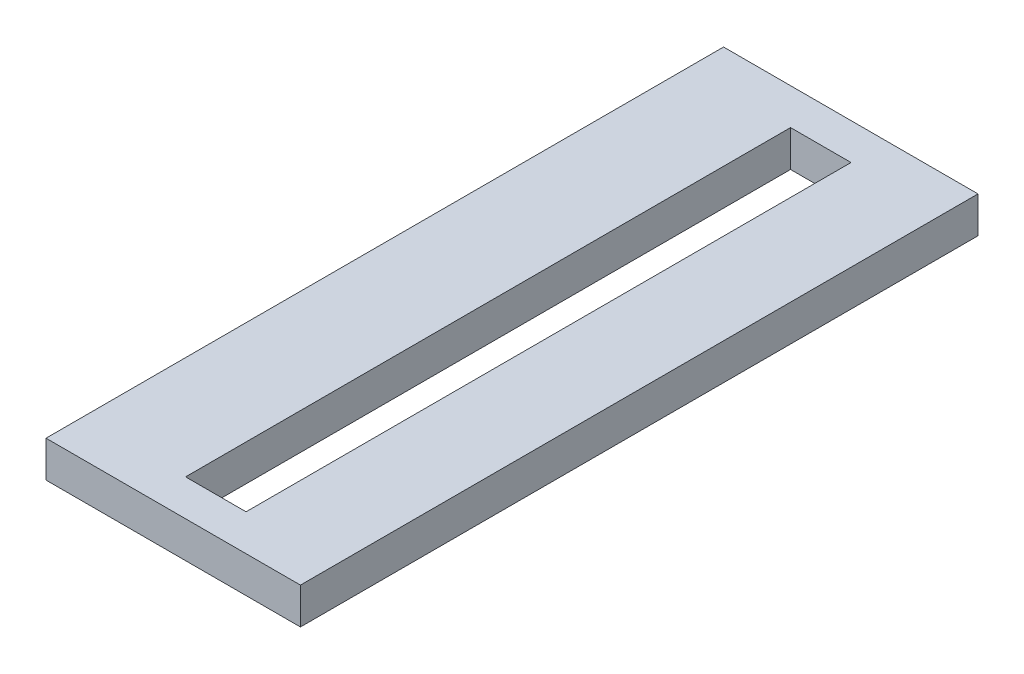
ISO-10303-21;
HEADER;
FILE_DESCRIPTION(('STEP AP214'),'2;1');
FILE_NAME('part.step','',(''),(''),'','','');
FILE_SCHEMA(('AUTOMOTIVE_DESIGN { 1 0 10303 214 1 1 1 1 }'));
ENDSEC;
DATA;
#1=APPLICATION_CONTEXT('core data for automotive mechanical design processes');
#2=APPLICATION_PROTOCOL_DEFINITION('international standard','automotive_design',2000,#1);
#3=PRODUCT_CONTEXT('',#1,'mechanical');
#4=PRODUCT('Part','Part','',(#3));
#5=PRODUCT_RELATED_PRODUCT_CATEGORY('part','',(#4));
#6=PRODUCT_DEFINITION_FORMATION('','',#4);
#7=PRODUCT_DEFINITION_CONTEXT('part definition',#1,'design');
#8=PRODUCT_DEFINITION('design','',#6,#7);
#9=PRODUCT_DEFINITION_SHAPE('','',#8);
#10=(LENGTH_UNIT() NAMED_UNIT(*) SI_UNIT(.MILLI.,.METRE.));
#11=(NAMED_UNIT(*) PLANE_ANGLE_UNIT() SI_UNIT($,.RADIAN.));
#12=(NAMED_UNIT(*) SI_UNIT($,.STERADIAN.) SOLID_ANGLE_UNIT());
#13=UNCERTAINTY_MEASURE_WITH_UNIT(LENGTH_MEASURE(1.E-05),#10,'distance_accuracy_value','');
#14=(GEOMETRIC_REPRESENTATION_CONTEXT(3) GLOBAL_UNCERTAINTY_ASSIGNED_CONTEXT((#13)) GLOBAL_UNIT_ASSIGNED_CONTEXT((#10,
#11,#12)) REPRESENTATION_CONTEXT('',''));
#15=CARTESIAN_POINT('',(0.,0.,0.));
#16=DIRECTION('',(0.,0.,1.));
#17=DIRECTION('',(1.,0.,0.));
#18=AXIS2_PLACEMENT_3D('',#15,#16,#17);
#19=CARTESIAN_POINT('',(0.,3.,0.));
#20=DIRECTION('',(0.,-1.,0.));
#21=DIRECTION('',(0.,0.,-1.));
#22=AXIS2_PLACEMENT_3D('',#19,#20,#21);
#23=PLANE('',#22);
#24=DIRECTION('',(0.,0.,-1.));
#25=VECTOR('',#24,1.);
#26=CARTESIAN_POINT('',(44.3067924994122,3.,-28.));
#27=LINE('',#26,#25);
#28=CARTESIAN_POINT('',(44.3067924994122,3.,28.));
#29=VERTEX_POINT('',#28);
#30=CARTESIAN_POINT('',(44.3067924994122,3.,-28.));
#31=VERTEX_POINT('',#30);
#32=EDGE_CURVE('E134',#29,#31,#27,.T.);
#33=ORIENTED_EDGE('',*,*,#32,.T.);
#34=DIRECTION('',(-1.,0.,0.));
#35=VECTOR('',#34,1.);
#36=CARTESIAN_POINT('',(44.3067924994122,3.,-28.));
#37=LINE('',#36,#35);
#38=CARTESIAN_POINT('',(23.2777161878062,3.,-28.));
#39=VERTEX_POINT('',#38);
#40=EDGE_CURVE('E137',#31,#39,#37,.T.);
#41=ORIENTED_EDGE('',*,*,#40,.T.);
#42=DIRECTION('',(0.,0.,1.));
#43=VECTOR('',#42,1.);
#44=CARTESIAN_POINT('',(23.2777161878062,3.,-28.));
#45=LINE('',#44,#43);
#46=CARTESIAN_POINT('',(23.2777161878062,3.,28.));
#47=VERTEX_POINT('',#46);
#48=EDGE_CURVE('E140',#39,#47,#45,.T.);
#49=ORIENTED_EDGE('',*,*,#48,.T.);
#50=DIRECTION('',(1.,0.,0.));
#51=VECTOR('',#50,1.);
#52=CARTESIAN_POINT('',(44.3067924994122,3.,28.));
#53=LINE('',#52,#51);
#54=EDGE_CURVE('E142',#47,#29,#53,.T.);
#55=ORIENTED_EDGE('',*,*,#54,.T.);
#56=EDGE_LOOP('',(#33,#41,#49,#55));
#57=FACE_BOUND('',#56,.T.);
#58=DIRECTION('',(0.,0.,1.));
#59=VECTOR('',#58,1.);
#60=CARTESIAN_POINT('',(31.8133356797978,3.,-25.));
#61=LINE('',#60,#59);
#62=CARTESIAN_POINT('',(31.8133356797978,3.,-25.));
#63=VERTEX_POINT('',#62);
#64=CARTESIAN_POINT('',(31.8133356797978,3.,25.));
#65=VERTEX_POINT('',#64);
#66=EDGE_CURVE('E98',#63,#65,#61,.T.);
#67=ORIENTED_EDGE('',*,*,#66,.F.);
#68=DIRECTION('',(-1.,0.,0.));
#69=VECTOR('',#68,1.);
#70=CARTESIAN_POINT('',(31.8133356797978,3.,-25.));
#71=LINE('',#70,#69);
#72=CARTESIAN_POINT('',(36.8133356797978,3.,-25.));
#73=VERTEX_POINT('',#72);
#74=EDGE_CURVE('E120',#73,#63,#71,.T.);
#75=ORIENTED_EDGE('',*,*,#74,.F.);
#76=DIRECTION('',(0.,0.,-1.));
#77=VECTOR('',#76,1.);
#78=CARTESIAN_POINT('',(36.8133356797978,3.,-25.));
#79=LINE('',#78,#77);
#80=CARTESIAN_POINT('',(36.8133356797978,3.,25.));
#81=VERTEX_POINT('',#80);
#82=EDGE_CURVE('E118',#81,#73,#79,.T.);
#83=ORIENTED_EDGE('',*,*,#82,.F.);
#84=DIRECTION('',(1.,0.,0.));
#85=VECTOR('',#84,1.);
#86=CARTESIAN_POINT('',(31.8133356797978,3.,25.));
#87=LINE('',#86,#85);
#88=EDGE_CURVE('E106',#65,#81,#87,.T.);
#89=ORIENTED_EDGE('',*,*,#88,.F.);
#90=EDGE_LOOP('',(#67,#75,#83,#89));
#91=FACE_BOUND('',#90,.T.);
#92=ADVANCED_FACE('F33',(#57,#91),#23,.F.);
#93=CARTESIAN_POINT('',(0.,0.,0.));
#94=DIRECTION('',(0.,-1.,0.));
#95=DIRECTION('',(0.,0.,-1.));
#96=AXIS2_PLACEMENT_3D('',#93,#94,#95);
#97=PLANE('',#96);
#98=DIRECTION('',(0.,0.,-1.));
#99=VECTOR('',#98,1.);
#100=CARTESIAN_POINT('',(44.3067924994122,0.,-28.));
#101=LINE('',#100,#99);
#102=CARTESIAN_POINT('',(44.3067924994122,0.,28.));
#103=VERTEX_POINT('',#102);
#104=CARTESIAN_POINT('',(44.3067924994122,0.,-28.));
#105=VERTEX_POINT('',#104);
#106=EDGE_CURVE('E114',#103,#105,#101,.T.);
#107=ORIENTED_EDGE('',*,*,#106,.F.);
#108=DIRECTION('',(1.,0.,0.));
#109=VECTOR('',#108,1.);
#110=CARTESIAN_POINT('',(44.3067924994122,0.,28.));
#111=LINE('',#110,#109);
#112=CARTESIAN_POINT('',(23.2777161878062,0.,28.));
#113=VERTEX_POINT('',#112);
#114=EDGE_CURVE('E138',#113,#103,#111,.T.);
#115=ORIENTED_EDGE('',*,*,#114,.F.);
#116=DIRECTION('',(0.,0.,1.));
#117=VECTOR('',#116,1.);
#118=CARTESIAN_POINT('',(23.2777161878062,0.,-28.));
#119=LINE('',#118,#117);
#120=CARTESIAN_POINT('',(23.2777161878062,0.,-28.));
#121=VERTEX_POINT('',#120);
#122=EDGE_CURVE('E149',#121,#113,#119,.T.);
#123=ORIENTED_EDGE('',*,*,#122,.F.);
#124=DIRECTION('',(-1.,0.,0.));
#125=VECTOR('',#124,1.);
#126=CARTESIAN_POINT('',(44.3067924994122,0.,-28.));
#127=LINE('',#126,#125);
#128=EDGE_CURVE('E147',#105,#121,#127,.T.);
#129=ORIENTED_EDGE('',*,*,#128,.F.);
#130=EDGE_LOOP('',(#107,#115,#123,#129));
#131=FACE_BOUND('',#130,.T.);
#132=DIRECTION('',(-1.,0.,0.));
#133=VECTOR('',#132,1.);
#134=CARTESIAN_POINT('',(31.8133356797978,0.,-25.));
#135=LINE('',#134,#133);
#136=CARTESIAN_POINT('',(36.8133356797978,0.,-25.));
#137=VERTEX_POINT('',#136);
#138=CARTESIAN_POINT('',(31.8133356797978,0.,-25.));
#139=VERTEX_POINT('',#138);
#140=EDGE_CURVE('E107',#137,#139,#135,.T.);
#141=ORIENTED_EDGE('',*,*,#140,.T.);
#142=DIRECTION('',(0.,0.,1.));
#143=VECTOR('',#142,1.);
#144=CARTESIAN_POINT('',(31.8133356797978,0.,-25.));
#145=LINE('',#144,#143);
#146=CARTESIAN_POINT('',(31.8133356797978,0.,25.));
#147=VERTEX_POINT('',#146);
#148=EDGE_CURVE('E56',#139,#147,#145,.T.);
#149=ORIENTED_EDGE('',*,*,#148,.T.);
#150=DIRECTION('',(1.,0.,0.));
#151=VECTOR('',#150,1.);
#152=CARTESIAN_POINT('',(31.8133356797978,0.,25.));
#153=LINE('',#152,#151);
#154=CARTESIAN_POINT('',(36.8133356797978,0.,25.));
#155=VERTEX_POINT('',#154);
#156=EDGE_CURVE('E113',#147,#155,#153,.T.);
#157=ORIENTED_EDGE('',*,*,#156,.T.);
#158=DIRECTION('',(0.,0.,-1.));
#159=VECTOR('',#158,1.);
#160=CARTESIAN_POINT('',(36.8133356797978,0.,-25.));
#161=LINE('',#160,#159);
#162=EDGE_CURVE('E126',#155,#137,#161,.T.);
#163=ORIENTED_EDGE('',*,*,#162,.T.);
#164=EDGE_LOOP('',(#141,#149,#157,#163));
#165=FACE_BOUND('',#164,.T.);
#166=ADVANCED_FACE('F167',(#131,#165),#97,.T.);
#167=CARTESIAN_POINT('',(44.3067924994122,3.,-28.));
#168=DIRECTION('',(-1.,0.,0.));
#169=DIRECTION('',(0.,0.,1.));
#170=AXIS2_PLACEMENT_3D('',#167,#168,#169);
#171=PLANE('',#170);
#172=ORIENTED_EDGE('',*,*,#106,.T.);
#173=DIRECTION('',(0.,-1.,0.));
#174=VECTOR('',#173,1.);
#175=CARTESIAN_POINT('',(44.3067924994122,3.,-28.));
#176=LINE('',#175,#174);
#177=EDGE_CURVE('E11',#31,#105,#176,.T.);
#178=ORIENTED_EDGE('',*,*,#177,.F.);
#179=ORIENTED_EDGE('',*,*,#32,.F.);
#180=DIRECTION('',(0.,-1.,0.));
#181=VECTOR('',#180,1.);
#182=CARTESIAN_POINT('',(44.3067924994122,3.,28.));
#183=LINE('',#182,#181);
#184=EDGE_CURVE('E144',#29,#103,#183,.T.);
#185=ORIENTED_EDGE('',*,*,#184,.T.);
#186=EDGE_LOOP('',(#172,#178,#179,#185));
#187=FACE_BOUND('',#186,.T.);
#188=ADVANCED_FACE('F35',(#187),#171,.F.);
#189=CARTESIAN_POINT('',(44.3067924994122,3.,-28.));
#190=DIRECTION('',(0.,0.,1.));
#191=DIRECTION('',(1.,0.,0.));
#192=AXIS2_PLACEMENT_3D('',#189,#190,#191);
#193=PLANE('',#192);
#194=ORIENTED_EDGE('',*,*,#128,.T.);
#195=DIRECTION('',(0.,-1.,0.));
#196=VECTOR('',#195,1.);
#197=CARTESIAN_POINT('',(23.2777161878062,3.,-28.));
#198=LINE('',#197,#196);
#199=EDGE_CURVE('E41',#39,#121,#198,.T.);
#200=ORIENTED_EDGE('',*,*,#199,.F.);
#201=ORIENTED_EDGE('',*,*,#40,.F.);
#202=ORIENTED_EDGE('',*,*,#177,.T.);
#203=EDGE_LOOP('',(#194,#200,#201,#202));
#204=FACE_BOUND('',#203,.T.);
#205=ADVANCED_FACE('F177',(#204),#193,.F.);
#206=CARTESIAN_POINT('',(23.2777161878062,3.,-28.));
#207=DIRECTION('',(1.,0.,0.));
#208=DIRECTION('',(0.,0.,-1.));
#209=AXIS2_PLACEMENT_3D('',#206,#207,#208);
#210=PLANE('',#209);
#211=ORIENTED_EDGE('',*,*,#122,.T.);
#212=DIRECTION('',(0.,-1.,0.));
#213=VECTOR('',#212,1.);
#214=CARTESIAN_POINT('',(23.2777161878062,3.,28.));
#215=LINE('',#214,#213);
#216=EDGE_CURVE('E154',#47,#113,#215,.T.);
#217=ORIENTED_EDGE('',*,*,#216,.F.);
#218=ORIENTED_EDGE('',*,*,#48,.F.);
#219=ORIENTED_EDGE('',*,*,#199,.T.);
#220=EDGE_LOOP('',(#211,#217,#218,#219));
#221=FACE_BOUND('',#220,.T.);
#222=ADVANCED_FACE('F161',(#221),#210,.F.);
#223=CARTESIAN_POINT('',(44.3067924994122,3.,28.));
#224=DIRECTION('',(0.,0.,-1.));
#225=DIRECTION('',(-1.,0.,0.));
#226=AXIS2_PLACEMENT_3D('',#223,#224,#225);
#227=PLANE('',#226);
#228=ORIENTED_EDGE('',*,*,#114,.T.);
#229=ORIENTED_EDGE('',*,*,#184,.F.);
#230=ORIENTED_EDGE('',*,*,#54,.F.);
#231=ORIENTED_EDGE('',*,*,#216,.T.);
#232=EDGE_LOOP('',(#228,#229,#230,#231));
#233=FACE_BOUND('',#232,.T.);
#234=ADVANCED_FACE('F171',(#233),#227,.F.);
#235=CARTESIAN_POINT('',(31.8133356797978,3.,-25.));
#236=DIRECTION('',(1.,0.,0.));
#237=DIRECTION('',(0.,0.,-1.));
#238=AXIS2_PLACEMENT_3D('',#235,#236,#237);
#239=PLANE('',#238);
#240=ORIENTED_EDGE('',*,*,#148,.F.);
#241=DIRECTION('',(0.,-1.,0.));
#242=VECTOR('',#241,1.);
#243=CARTESIAN_POINT('',(31.8133356797978,3.,-25.));
#244=LINE('',#243,#242);
#245=EDGE_CURVE('E102',#63,#139,#244,.T.);
#246=ORIENTED_EDGE('',*,*,#245,.F.);
#247=ORIENTED_EDGE('',*,*,#66,.T.);
#248=DIRECTION('',(0.,-1.,0.));
#249=VECTOR('',#248,1.);
#250=CARTESIAN_POINT('',(31.8133356797978,3.,25.));
#251=LINE('',#250,#249);
#252=EDGE_CURVE('E101',#65,#147,#251,.T.);
#253=ORIENTED_EDGE('',*,*,#252,.T.);
#254=EDGE_LOOP('',(#240,#246,#247,#253));
#255=FACE_BOUND('',#254,.T.);
#256=ADVANCED_FACE('F100',(#255),#239,.T.);
#257=CARTESIAN_POINT('',(31.8133356797978,3.,25.));
#258=DIRECTION('',(0.,0.,-1.));
#259=DIRECTION('',(-1.,0.,0.));
#260=AXIS2_PLACEMENT_3D('',#257,#258,#259);
#261=PLANE('',#260);
#262=ORIENTED_EDGE('',*,*,#156,.F.);
#263=ORIENTED_EDGE('',*,*,#252,.F.);
#264=ORIENTED_EDGE('',*,*,#88,.T.);
#265=DIRECTION('',(0.,-1.,0.));
#266=VECTOR('',#265,1.);
#267=CARTESIAN_POINT('',(36.8133356797978,3.,25.));
#268=LINE('',#267,#266);
#269=EDGE_CURVE('E115',#81,#155,#268,.T.);
#270=ORIENTED_EDGE('',*,*,#269,.T.);
#271=EDGE_LOOP('',(#262,#263,#264,#270));
#272=FACE_BOUND('',#271,.T.);
#273=ADVANCED_FACE('F110',(#272),#261,.T.);
#274=CARTESIAN_POINT('',(36.8133356797978,3.,-25.));
#275=DIRECTION('',(-1.,0.,0.));
#276=DIRECTION('',(0.,0.,1.));
#277=AXIS2_PLACEMENT_3D('',#274,#275,#276);
#278=PLANE('',#277);
#279=ORIENTED_EDGE('',*,*,#162,.F.);
#280=ORIENTED_EDGE('',*,*,#269,.F.);
#281=ORIENTED_EDGE('',*,*,#82,.T.);
#282=DIRECTION('',(0.,-1.,0.));
#283=VECTOR('',#282,1.);
#284=CARTESIAN_POINT('',(36.8133356797978,3.,-25.));
#285=LINE('',#284,#283);
#286=EDGE_CURVE('E48',#73,#137,#285,.T.);
#287=ORIENTED_EDGE('',*,*,#286,.T.);
#288=EDGE_LOOP('',(#279,#280,#281,#287));
#289=FACE_BOUND('',#288,.T.);
#290=ADVANCED_FACE('F200',(#289),#278,.T.);
#291=CARTESIAN_POINT('',(31.8133356797978,3.,-25.));
#292=DIRECTION('',(0.,0.,1.));
#293=DIRECTION('',(1.,0.,0.));
#294=AXIS2_PLACEMENT_3D('',#291,#292,#293);
#295=PLANE('',#294);
#296=ORIENTED_EDGE('',*,*,#140,.F.);
#297=ORIENTED_EDGE('',*,*,#286,.F.);
#298=ORIENTED_EDGE('',*,*,#74,.T.);
#299=ORIENTED_EDGE('',*,*,#245,.T.);
#300=EDGE_LOOP('',(#296,#297,#298,#299));
#301=FACE_BOUND('',#300,.T.);
#302=ADVANCED_FACE('F204',(#301),#295,.T.);
#303=CLOSED_SHELL('',(#92,#166,#188,#205,#222,#234,#256,#273,#290,#302));
#304=MANIFOLD_SOLID_BREP('B2',#303);
#305=ADVANCED_BREP_SHAPE_REPRESENTATION('',(#18,#304),#14);
#306=SHAPE_DEFINITION_REPRESENTATION(#9,#305);
ENDSEC;
END-ISO-10303-21;
